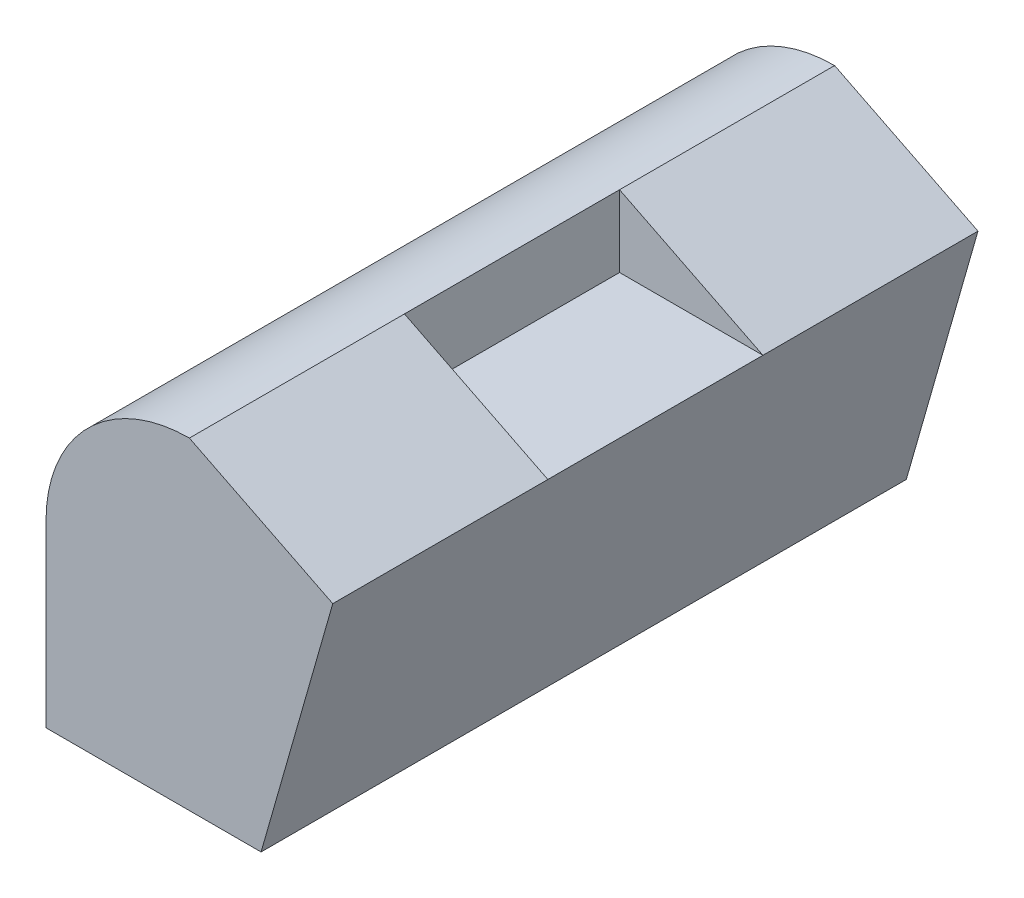
ISO-10303-21;
HEADER;
FILE_DESCRIPTION(('STEP AP214'),'2;1');
FILE_NAME('part.step','',(''),(''),'','','');
FILE_SCHEMA(('AUTOMOTIVE_DESIGN { 1 0 10303 214 1 1 1 1 }'));
ENDSEC;
DATA;
#1=APPLICATION_CONTEXT('core data for automotive mechanical design processes');
#2=APPLICATION_PROTOCOL_DEFINITION('international standard','automotive_design',2000,#1);
#3=PRODUCT_CONTEXT('',#1,'mechanical');
#4=PRODUCT('Part','Part','',(#3));
#5=PRODUCT_RELATED_PRODUCT_CATEGORY('part','',(#4));
#6=PRODUCT_DEFINITION_FORMATION('','',#4);
#7=PRODUCT_DEFINITION_CONTEXT('part definition',#1,'design');
#8=PRODUCT_DEFINITION('design','',#6,#7);
#9=PRODUCT_DEFINITION_SHAPE('','',#8);
#10=(LENGTH_UNIT() NAMED_UNIT(*) SI_UNIT(.MILLI.,.METRE.));
#11=(NAMED_UNIT(*) PLANE_ANGLE_UNIT() SI_UNIT($,.RADIAN.));
#12=(NAMED_UNIT(*) SI_UNIT($,.STERADIAN.) SOLID_ANGLE_UNIT());
#13=UNCERTAINTY_MEASURE_WITH_UNIT(LENGTH_MEASURE(1.E-05),#10,'distance_accuracy_value','');
#14=(GEOMETRIC_REPRESENTATION_CONTEXT(3) GLOBAL_UNCERTAINTY_ASSIGNED_CONTEXT((#13)) GLOBAL_UNIT_ASSIGNED_CONTEXT((#10,
#11,#12)) REPRESENTATION_CONTEXT('',''));
#15=CARTESIAN_POINT('',(0.,0.,0.));
#16=DIRECTION('',(0.,0.,1.));
#17=DIRECTION('',(1.,0.,0.));
#18=AXIS2_PLACEMENT_3D('',#15,#16,#17);
#19=CARTESIAN_POINT('',(22.,44.,45.));
#20=DIRECTION('',(0.447213595499958,0.894427190999916,0.));
#21=DIRECTION('',(-0.894427190999916,0.447213595499958,0.));
#22=AXIS2_PLACEMENT_3D('',#19,#20,#21);
#23=PLANE('',#22);
#24=DIRECTION('',(0.,0.,-1.));
#25=VECTOR('',#24,1.);
#26=CARTESIAN_POINT('',(20.,45.,45.));
#27=LINE('',#26,#25);
#28=CARTESIAN_POINT('',(20.,45.,-15.));
#29=VERTEX_POINT('',#28);
#30=CARTESIAN_POINT('',(20.,45.,-45.));
#31=VERTEX_POINT('',#30);
#32=EDGE_CURVE('E41',#29,#31,#27,.T.);
#33=ORIENTED_EDGE('',*,*,#32,.F.);
#34=DIRECTION('',(0.894427190999916,-0.447213595499958,0.));
#35=VECTOR('',#34,1.);
#36=CARTESIAN_POINT('',(22.,44.,-15.));
#37=LINE('',#36,#35);
#38=CARTESIAN_POINT('',(40.,35.,-15.));
#39=VERTEX_POINT('',#38);
#40=EDGE_CURVE('E173',#29,#39,#37,.T.);
#41=ORIENTED_EDGE('',*,*,#40,.T.);
#42=DIRECTION('',(0.,0.,-1.));
#43=VECTOR('',#42,1.);
#44=CARTESIAN_POINT('',(40.,35.,45.));
#45=LINE('',#44,#43);
#46=CARTESIAN_POINT('',(40.,35.,-45.));
#47=VERTEX_POINT('',#46);
#48=EDGE_CURVE('E82',#39,#47,#45,.T.);
#49=ORIENTED_EDGE('',*,*,#48,.T.);
#50=DIRECTION('',(0.894427190999916,-0.447213595499958,0.));
#51=VECTOR('',#50,1.);
#52=CARTESIAN_POINT('',(22.,44.,-45.));
#53=LINE('',#52,#51);
#54=EDGE_CURVE('E126',#31,#47,#53,.T.);
#55=ORIENTED_EDGE('',*,*,#54,.F.);
#56=EDGE_LOOP('',(#33,#41,#49,#55));
#57=FACE_BOUND('',#56,.T.);
#58=ADVANCED_FACE('F33',(#57),#23,.T.);
#59=DIRECTION('',(0.894427190999916,-0.447213595499958,0.));
#60=VECTOR('',#59,1.);
#61=CARTESIAN_POINT('',(22.,44.,15.));
#62=LINE('',#61,#60);
#63=CARTESIAN_POINT('',(20.,45.,15.));
#64=VERTEX_POINT('',#63);
#65=CARTESIAN_POINT('',(40.,35.,15.));
#66=VERTEX_POINT('',#65);
#67=EDGE_CURVE('E160',#64,#66,#62,.T.);
#68=ORIENTED_EDGE('',*,*,#67,.F.);
#69=CARTESIAN_POINT('',(20.,45.,45.));
#70=VERTEX_POINT('',#69);
#71=EDGE_CURVE('E11',#70,#64,#27,.T.);
#72=ORIENTED_EDGE('',*,*,#71,.F.);
#73=DIRECTION('',(0.894427190999916,-0.447213595499958,0.));
#74=VECTOR('',#73,1.);
#75=CARTESIAN_POINT('',(22.,44.,45.));
#76=LINE('',#75,#74);
#77=CARTESIAN_POINT('',(40.,35.,45.));
#78=VERTEX_POINT('',#77);
#79=EDGE_CURVE('E121',#70,#78,#76,.T.);
#80=ORIENTED_EDGE('',*,*,#79,.T.);
#81=EDGE_CURVE('E138',#78,#66,#45,.T.);
#82=ORIENTED_EDGE('',*,*,#81,.T.);
#83=EDGE_LOOP('',(#68,#72,#80,#82));
#84=FACE_BOUND('',#83,.T.);
#85=ADVANCED_FACE('F35',(#84),#23,.T.);
#86=CARTESIAN_POINT('',(20.,25.,45.));
#87=DIRECTION('',(0.,0.,-1.));
#88=DIRECTION('',(-1.,0.,0.));
#89=AXIS2_PLACEMENT_3D('',#86,#87,#88);
#90=CYLINDRICAL_SURFACE('',#89,20.);
#91=CARTESIAN_POINT('',(20.,25.,-45.));
#92=DIRECTION('',(0.,0.,1.));
#93=DIRECTION('',(1.,0.,0.));
#94=AXIS2_PLACEMENT_3D('',#91,#92,#93);
#95=CIRCLE('',#94,20.);
#96=CARTESIAN_POINT('',(0.,25.,-45.));
#97=VERTEX_POINT('',#96);
#98=EDGE_CURVE('E129',#31,#97,#95,.T.);
#99=ORIENTED_EDGE('',*,*,#98,.T.);
#100=DIRECTION('',(0.,0.,-1.));
#101=VECTOR('',#100,1.);
#102=CARTESIAN_POINT('',(0.,25.,45.));
#103=LINE('',#102,#101);
#104=CARTESIAN_POINT('',(0.,25.,45.));
#105=VERTEX_POINT('',#104);
#106=EDGE_CURVE('E109',#105,#97,#103,.T.);
#107=ORIENTED_EDGE('',*,*,#106,.F.);
#108=CARTESIAN_POINT('',(20.,25.,45.));
#109=DIRECTION('',(0.,0.,1.));
#110=DIRECTION('',(1.,0.,0.));
#111=AXIS2_PLACEMENT_3D('',#108,#109,#110);
#112=CIRCLE('',#111,20.);
#113=EDGE_CURVE('E118',#70,#105,#112,.T.);
#114=ORIENTED_EDGE('',*,*,#113,.F.);
#115=ORIENTED_EDGE('',*,*,#71,.T.);
#116=DIRECTION('',(0.,0.,1.));
#117=VECTOR('',#116,1.);
#118=CARTESIAN_POINT('',(20.,45.,-15.));
#119=LINE('',#118,#117);
#120=EDGE_CURVE('E148',#29,#64,#119,.T.);
#121=ORIENTED_EDGE('',*,*,#120,.F.);
#122=ORIENTED_EDGE('',*,*,#32,.T.);
#123=EDGE_LOOP('',(#99,#107,#114,#115,#121,#122));
#124=FACE_BOUND('',#123,.T.);
#125=ADVANCED_FACE('F145',(#124),#90,.T.);
#126=CARTESIAN_POINT('',(0.,0.,45.));
#127=DIRECTION('',(-1.,0.,0.));
#128=DIRECTION('',(0.,0.,1.));
#129=AXIS2_PLACEMENT_3D('',#126,#127,#128);
#130=PLANE('',#129);
#131=DIRECTION('',(0.,1.,0.));
#132=VECTOR('',#131,1.);
#133=CARTESIAN_POINT('',(0.,0.,-45.));
#134=LINE('',#133,#132);
#135=CARTESIAN_POINT('',(0.,0.,-45.));
#136=VERTEX_POINT('',#135);
#137=EDGE_CURVE('E106',#136,#97,#134,.T.);
#138=ORIENTED_EDGE('',*,*,#137,.F.);
#139=DIRECTION('',(0.,0.,-1.));
#140=VECTOR('',#139,1.);
#141=CARTESIAN_POINT('',(0.,0.,45.));
#142=LINE('',#141,#140);
#143=CARTESIAN_POINT('',(0.,0.,45.));
#144=VERTEX_POINT('',#143);
#145=EDGE_CURVE('E100',#144,#136,#142,.T.);
#146=ORIENTED_EDGE('',*,*,#145,.F.);
#147=DIRECTION('',(0.,1.,0.));
#148=VECTOR('',#147,1.);
#149=CARTESIAN_POINT('',(0.,0.,45.));
#150=LINE('',#149,#148);
#151=EDGE_CURVE('E104',#144,#105,#150,.T.);
#152=ORIENTED_EDGE('',*,*,#151,.T.);
#153=ORIENTED_EDGE('',*,*,#106,.T.);
#154=EDGE_LOOP('',(#138,#146,#152,#153));
#155=FACE_BOUND('',#154,.T.);
#156=ADVANCED_FACE('F102',(#155),#130,.T.);
#157=CARTESIAN_POINT('',(0.,0.,45.));
#158=DIRECTION('',(0.,1.,0.));
#159=DIRECTION('',(0.,0.,1.));
#160=AXIS2_PLACEMENT_3D('',#157,#158,#159);
#161=PLANE('',#160);
#162=DIRECTION('',(1.,0.,0.));
#163=VECTOR('',#162,1.);
#164=CARTESIAN_POINT('',(0.,0.,-45.));
#165=LINE('',#164,#163);
#166=CARTESIAN_POINT('',(30.,0.,-45.));
#167=VERTEX_POINT('',#166);
#168=EDGE_CURVE('E134',#136,#167,#165,.T.);
#169=ORIENTED_EDGE('',*,*,#168,.T.);
#170=DIRECTION('',(0.,0.,-1.));
#171=VECTOR('',#170,1.);
#172=CARTESIAN_POINT('',(30.,0.,45.));
#173=LINE('',#172,#171);
#174=CARTESIAN_POINT('',(30.,0.,45.));
#175=VERTEX_POINT('',#174);
#176=EDGE_CURVE('E110',#175,#167,#173,.T.);
#177=ORIENTED_EDGE('',*,*,#176,.F.);
#178=DIRECTION('',(1.,0.,0.));
#179=VECTOR('',#178,1.);
#180=CARTESIAN_POINT('',(0.,0.,45.));
#181=LINE('',#180,#179);
#182=EDGE_CURVE('E113',#144,#175,#181,.T.);
#183=ORIENTED_EDGE('',*,*,#182,.F.);
#184=ORIENTED_EDGE('',*,*,#145,.T.);
#185=EDGE_LOOP('',(#169,#177,#183,#184));
#186=FACE_BOUND('',#185,.T.);
#187=ADVANCED_FACE('F114',(#186),#161,.F.);
#188=CARTESIAN_POINT('',(27.7358490566038,-7.92452830188679,45.));
#189=DIRECTION('',(-0.961523947640823,0.274721127897378,0.));
#190=DIRECTION('',(-0.274721127897378,-0.961523947640823,0.));
#191=AXIS2_PLACEMENT_3D('',#188,#189,#190);
#192=PLANE('',#191);
#193=DIRECTION('',(0.274721127897378,0.961523947640823,0.));
#194=VECTOR('',#193,1.);
#195=CARTESIAN_POINT('',(27.7358490566038,-7.92452830188679,-45.));
#196=LINE('',#195,#194);
#197=EDGE_CURVE('E136',#167,#47,#196,.T.);
#198=ORIENTED_EDGE('',*,*,#197,.T.);
#199=ORIENTED_EDGE('',*,*,#48,.F.);
#200=DIRECTION('',(0.,0.,1.));
#201=VECTOR('',#200,1.);
#202=CARTESIAN_POINT('',(40.,35.,-15.));
#203=LINE('',#202,#201);
#204=EDGE_CURVE('E130',#39,#66,#203,.T.);
#205=ORIENTED_EDGE('',*,*,#204,.T.);
#206=ORIENTED_EDGE('',*,*,#81,.F.);
#207=DIRECTION('',(0.274721127897378,0.961523947640823,0.));
#208=VECTOR('',#207,1.);
#209=CARTESIAN_POINT('',(27.7358490566038,-7.92452830188679,45.));
#210=LINE('',#209,#208);
#211=EDGE_CURVE('E57',#175,#78,#210,.T.);
#212=ORIENTED_EDGE('',*,*,#211,.F.);
#213=ORIENTED_EDGE('',*,*,#176,.T.);
#214=EDGE_LOOP('',(#198,#199,#205,#206,#212,#213));
#215=FACE_BOUND('',#214,.T.);
#216=ADVANCED_FACE('F187',(#215),#192,.F.);
#217=CARTESIAN_POINT('',(0.,0.,45.));
#218=DIRECTION('',(0.,0.,1.));
#219=DIRECTION('',(1.,0.,0.));
#220=AXIS2_PLACEMENT_3D('',#217,#218,#219);
#221=PLANE('',#220);
#222=ORIENTED_EDGE('',*,*,#79,.F.);
#223=ORIENTED_EDGE('',*,*,#113,.T.);
#224=ORIENTED_EDGE('',*,*,#151,.F.);
#225=ORIENTED_EDGE('',*,*,#182,.T.);
#226=ORIENTED_EDGE('',*,*,#211,.T.);
#227=EDGE_LOOP('',(#222,#223,#224,#225,#226));
#228=FACE_BOUND('',#227,.T.);
#229=ADVANCED_FACE('F117',(#228),#221,.T.);
#230=CARTESIAN_POINT('',(0.,0.,-45.));
#231=DIRECTION('',(0.,0.,1.));
#232=DIRECTION('',(1.,0.,0.));
#233=AXIS2_PLACEMENT_3D('',#230,#231,#232);
#234=PLANE('',#233);
#235=ORIENTED_EDGE('',*,*,#54,.T.);
#236=ORIENTED_EDGE('',*,*,#197,.F.);
#237=ORIENTED_EDGE('',*,*,#168,.F.);
#238=ORIENTED_EDGE('',*,*,#137,.T.);
#239=ORIENTED_EDGE('',*,*,#98,.F.);
#240=EDGE_LOOP('',(#235,#236,#237,#238,#239));
#241=FACE_BOUND('',#240,.T.);
#242=ADVANCED_FACE('F150',(#241),#234,.F.);
#243=CARTESIAN_POINT('',(0.,35.,-15.));
#244=DIRECTION('',(0.,-1.,0.));
#245=DIRECTION('',(0.,0.,-1.));
#246=AXIS2_PLACEMENT_3D('',#243,#244,#245);
#247=PLANE('',#246);
#248=DIRECTION('',(1.,0.,0.));
#249=VECTOR('',#248,1.);
#250=CARTESIAN_POINT('',(0.,35.,15.));
#251=LINE('',#250,#249);
#252=CARTESIAN_POINT('',(20.,35.,15.));
#253=VERTEX_POINT('',#252);
#254=EDGE_CURVE('E48',#253,#66,#251,.T.);
#255=ORIENTED_EDGE('',*,*,#254,.T.);
#256=ORIENTED_EDGE('',*,*,#204,.F.);
#257=DIRECTION('',(1.,0.,0.));
#258=VECTOR('',#257,1.);
#259=CARTESIAN_POINT('',(0.,35.,-15.));
#260=LINE('',#259,#258);
#261=CARTESIAN_POINT('',(20.,35.,-15.));
#262=VERTEX_POINT('',#261);
#263=EDGE_CURVE('E169',#262,#39,#260,.T.);
#264=ORIENTED_EDGE('',*,*,#263,.F.);
#265=DIRECTION('',(0.,0.,1.));
#266=VECTOR('',#265,1.);
#267=CARTESIAN_POINT('',(20.,35.,-15.));
#268=LINE('',#267,#266);
#269=EDGE_CURVE('E168',#262,#253,#268,.T.);
#270=ORIENTED_EDGE('',*,*,#269,.T.);
#271=EDGE_LOOP('',(#255,#256,#264,#270));
#272=FACE_BOUND('',#271,.T.);
#273=ADVANCED_FACE('F189',(#272),#247,.F.);
#274=CARTESIAN_POINT('',(20.,0.,-15.));
#275=DIRECTION('',(-1.,0.,0.));
#276=DIRECTION('',(0.,-1.,0.));
#277=AXIS2_PLACEMENT_3D('',#274,#275,#276);
#278=PLANE('',#277);
#279=DIRECTION('',(0.,-1.,0.));
#280=VECTOR('',#279,1.);
#281=CARTESIAN_POINT('',(20.,0.,15.));
#282=LINE('',#281,#280);
#283=EDGE_CURVE('E164',#64,#253,#282,.T.);
#284=ORIENTED_EDGE('',*,*,#283,.T.);
#285=ORIENTED_EDGE('',*,*,#269,.F.);
#286=DIRECTION('',(0.,-1.,0.));
#287=VECTOR('',#286,1.);
#288=CARTESIAN_POINT('',(20.,0.,-15.));
#289=LINE('',#288,#287);
#290=EDGE_CURVE('E178',#29,#262,#289,.T.);
#291=ORIENTED_EDGE('',*,*,#290,.F.);
#292=ORIENTED_EDGE('',*,*,#120,.T.);
#293=EDGE_LOOP('',(#284,#285,#291,#292));
#294=FACE_BOUND('',#293,.T.);
#295=ADVANCED_FACE('F194',(#294),#278,.F.);
#296=CARTESIAN_POINT('',(0.,0.,-15.));
#297=DIRECTION('',(0.,0.,1.));
#298=DIRECTION('',(1.,0.,0.));
#299=AXIS2_PLACEMENT_3D('',#296,#297,#298);
#300=PLANE('',#299);
#301=ORIENTED_EDGE('',*,*,#40,.F.);
#302=ORIENTED_EDGE('',*,*,#290,.T.);
#303=ORIENTED_EDGE('',*,*,#263,.T.);
#304=EDGE_LOOP('',(#301,#302,#303));
#305=FACE_BOUND('',#304,.T.);
#306=ADVANCED_FACE('F190',(#305),#300,.T.);
#307=CARTESIAN_POINT('',(0.,0.,15.));
#308=DIRECTION('',(0.,0.,1.));
#309=DIRECTION('',(1.,0.,0.));
#310=AXIS2_PLACEMENT_3D('',#307,#308,#309);
#311=PLANE('',#310);
#312=ORIENTED_EDGE('',*,*,#67,.T.);
#313=ORIENTED_EDGE('',*,*,#254,.F.);
#314=ORIENTED_EDGE('',*,*,#283,.F.);
#315=EDGE_LOOP('',(#312,#313,#314));
#316=FACE_BOUND('',#315,.T.);
#317=ADVANCED_FACE('F196',(#316),#311,.F.);
#318=CLOSED_SHELL('',(#58,#85,#125,#156,#187,#216,#229,#242,#273,#295,#306,#317));
#319=MANIFOLD_SOLID_BREP('B2',#318);
#320=ADVANCED_BREP_SHAPE_REPRESENTATION('',(#18,#319),#14);
#321=SHAPE_DEFINITION_REPRESENTATION(#9,#320);
ENDSEC;
END-ISO-10303-21;
